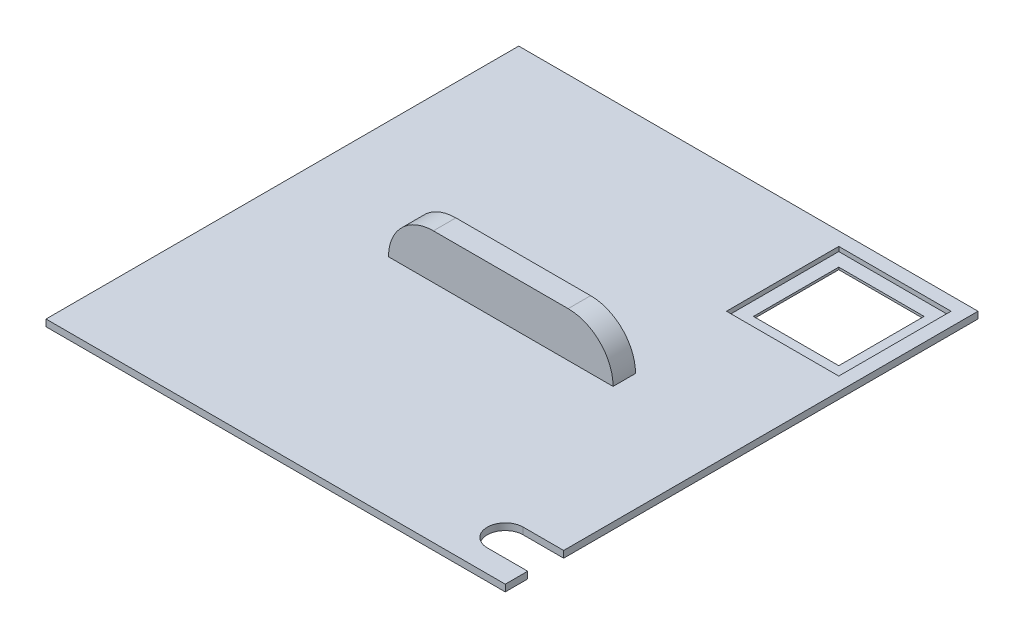
ISO-10303-21;
HEADER;
FILE_DESCRIPTION(('STEP AP214'),'2;1');
FILE_NAME('part.step','',(''),(''),'','','');
FILE_SCHEMA(('AUTOMOTIVE_DESIGN { 1 0 10303 214 1 1 1 1 }'));
ENDSEC;
DATA;
#1=APPLICATION_CONTEXT('core data for automotive mechanical design processes');
#2=APPLICATION_PROTOCOL_DEFINITION('international standard','automotive_design',2000,#1);
#3=PRODUCT_CONTEXT('',#1,'mechanical');
#4=PRODUCT('Part','Part','',(#3));
#5=PRODUCT_RELATED_PRODUCT_CATEGORY('part','',(#4));
#6=PRODUCT_DEFINITION_FORMATION('','',#4);
#7=PRODUCT_DEFINITION_CONTEXT('part definition',#1,'design');
#8=PRODUCT_DEFINITION('design','',#6,#7);
#9=PRODUCT_DEFINITION_SHAPE('','',#8);
#10=(LENGTH_UNIT() NAMED_UNIT(*) SI_UNIT(.MILLI.,.METRE.));
#11=(NAMED_UNIT(*) PLANE_ANGLE_UNIT() SI_UNIT($,.RADIAN.));
#12=(NAMED_UNIT(*) SI_UNIT($,.STERADIAN.) SOLID_ANGLE_UNIT());
#13=UNCERTAINTY_MEASURE_WITH_UNIT(LENGTH_MEASURE(1.E-05),#10,'distance_accuracy_value','');
#14=(GEOMETRIC_REPRESENTATION_CONTEXT(3) GLOBAL_UNCERTAINTY_ASSIGNED_CONTEXT((#13)) GLOBAL_UNIT_ASSIGNED_CONTEXT((#10,
#11,#12)) REPRESENTATION_CONTEXT('',''));
#15=CARTESIAN_POINT('',(0.,0.,0.));
#16=DIRECTION('',(0.,0.,1.));
#17=DIRECTION('',(1.,0.,0.));
#18=AXIS2_PLACEMENT_3D('',#15,#16,#17);
#19=CARTESIAN_POINT('',(0.,0.5,0.));
#20=DIRECTION('',(0.,1.,0.));
#21=DIRECTION('',(0.,0.,1.));
#22=AXIS2_PLACEMENT_3D('',#19,#20,#21);
#23=PLANE('',#22);
#24=DIRECTION('',(0.,0.,-1.));
#25=VECTOR('',#24,1.);
#26=CARTESIAN_POINT('',(23.125,0.5,0.));
#27=LINE('',#26,#25);
#28=CARTESIAN_POINT('',(23.125,0.5,-24.625));
#29=VERTEX_POINT('',#28);
#30=CARTESIAN_POINT('',(23.1249999999999,0.5,-49.6250000000001));
#31=VERTEX_POINT('',#30);
#32=EDGE_CURVE('E207',#29,#31,#27,.T.);
#33=ORIENTED_EDGE('',*,*,#32,.F.);
#34=DIRECTION('',(-1.,0.,0.));
#35=VECTOR('',#34,1.);
#36=CARTESIAN_POINT('',(0.,0.5,-24.625));
#37=LINE('',#36,#35);
#38=CARTESIAN_POINT('',(48.125,0.5,-24.625));
#39=VERTEX_POINT('',#38);
#40=EDGE_CURVE('E209',#39,#29,#37,.T.);
#41=ORIENTED_EDGE('',*,*,#40,.F.);
#42=DIRECTION('',(0.,0.,-1.));
#43=VECTOR('',#42,1.);
#44=CARTESIAN_POINT('',(48.125,0.5,0.));
#45=LINE('',#44,#43);
#46=CARTESIAN_POINT('',(48.125,0.5,-49.625));
#47=VERTEX_POINT('',#46);
#48=EDGE_CURVE('E212',#39,#47,#45,.T.);
#49=ORIENTED_EDGE('',*,*,#48,.T.);
#50=DIRECTION('',(-1.,0.,0.));
#51=VECTOR('',#50,1.);
#52=CARTESIAN_POINT('',(0.,0.5,-49.6250000000001));
#53=LINE('',#52,#51);
#54=EDGE_CURVE('E215',#47,#31,#53,.T.);
#55=ORIENTED_EDGE('',*,*,#54,.T.);
#56=EDGE_LOOP('',(#33,#41,#49,#55));
#57=FACE_BOUND('',#56,.T.);
#58=DIRECTION('',(1.,0.,0.));
#59=VECTOR('',#58,1.);
#60=CARTESIAN_POINT('',(0.,0.5,-46.625));
#61=LINE('',#60,#59);
#62=CARTESIAN_POINT('',(26.125,0.5,-46.625));
#63=VERTEX_POINT('',#62);
#64=CARTESIAN_POINT('',(45.125,0.5,-46.625));
#65=VERTEX_POINT('',#64);
#66=EDGE_CURVE('E182',#63,#65,#61,.T.);
#67=ORIENTED_EDGE('',*,*,#66,.T.);
#68=DIRECTION('',(0.,0.,1.));
#69=VECTOR('',#68,1.);
#70=CARTESIAN_POINT('',(45.125,0.5,0.));
#71=LINE('',#70,#69);
#72=CARTESIAN_POINT('',(45.125,0.5,-27.625));
#73=VERTEX_POINT('',#72);
#74=EDGE_CURVE('E190',#65,#73,#71,.T.);
#75=ORIENTED_EDGE('',*,*,#74,.T.);
#76=DIRECTION('',(1.,0.,0.));
#77=VECTOR('',#76,1.);
#78=CARTESIAN_POINT('',(0.,0.5,-27.625));
#79=LINE('',#78,#77);
#80=CARTESIAN_POINT('',(26.125,0.5,-27.625));
#81=VERTEX_POINT('',#80);
#82=EDGE_CURVE('E187',#81,#73,#79,.T.);
#83=ORIENTED_EDGE('',*,*,#82,.F.);
#84=DIRECTION('',(0.,0.,1.));
#85=VECTOR('',#84,1.);
#86=CARTESIAN_POINT('',(26.125,0.5,0.));
#87=LINE('',#86,#85);
#88=EDGE_CURVE('E58',#63,#81,#87,.T.);
#89=ORIENTED_EDGE('',*,*,#88,.F.);
#90=EDGE_LOOP('',(#67,#75,#83,#89));
#91=FACE_BOUND('',#90,.T.);
#92=ADVANCED_FACE('F43',(#57,#91),#23,.T.);
#93=CARTESIAN_POINT('',(0.,0.,0.));
#94=DIRECTION('',(0.,1.,0.));
#95=DIRECTION('',(0.,0.,1.));
#96=AXIS2_PLACEMENT_3D('',#93,#94,#95);
#97=PLANE('',#96);
#98=CARTESIAN_POINT('',(42.125,0.,43.625));
#99=DIRECTION('',(0.,1.,0.));
#100=DIRECTION('',(0.,0.,1.));
#101=AXIS2_PLACEMENT_3D('',#98,#99,#100);
#102=CIRCLE('',#101,4.);
#103=CARTESIAN_POINT('',(42.125,0.,39.625));
#104=VERTEX_POINT('',#103);
#105=CARTESIAN_POINT('',(42.125,0.,47.625));
#106=VERTEX_POINT('',#105);
#107=EDGE_CURVE('E267',#104,#106,#102,.T.);
#108=ORIENTED_EDGE('',*,*,#107,.T.);
#109=DIRECTION('',(1.,0.,0.));
#110=VECTOR('',#109,1.);
#111=CARTESIAN_POINT('',(0.,0.,47.625));
#112=LINE('',#111,#110);
#113=CARTESIAN_POINT('',(51.125,0.,47.625));
#114=VERTEX_POINT('',#113);
#115=EDGE_CURVE('E274',#106,#114,#112,.T.);
#116=ORIENTED_EDGE('',*,*,#115,.T.);
#117=DIRECTION('',(0.,0.,1.));
#118=VECTOR('',#117,1.);
#119=CARTESIAN_POINT('',(51.125,0.,0.));
#120=LINE('',#119,#118);
#121=CARTESIAN_POINT('',(51.125,0.,52.625));
#122=VERTEX_POINT('',#121);
#123=EDGE_CURVE('E300',#114,#122,#120,.T.);
#124=ORIENTED_EDGE('',*,*,#123,.T.);
#125=DIRECTION('',(1.,0.,0.));
#126=VECTOR('',#125,1.);
#127=CARTESIAN_POINT('',(0.,0.,52.625));
#128=LINE('',#127,#126);
#129=CARTESIAN_POINT('',(-51.125,0.,52.625));
#130=VERTEX_POINT('',#129);
#131=EDGE_CURVE('E305',#130,#122,#128,.T.);
#132=ORIENTED_EDGE('',*,*,#131,.F.);
#133=DIRECTION('',(0.,0.,1.));
#134=VECTOR('',#133,1.);
#135=CARTESIAN_POINT('',(-51.125,0.,0.));
#136=LINE('',#135,#134);
#137=CARTESIAN_POINT('',(-51.125,0.,-52.625));
#138=VERTEX_POINT('',#137);
#139=EDGE_CURVE('E303',#138,#130,#136,.T.);
#140=ORIENTED_EDGE('',*,*,#139,.F.);
#141=DIRECTION('',(1.,0.,0.));
#142=VECTOR('',#141,1.);
#143=CARTESIAN_POINT('',(0.,0.,-52.625));
#144=LINE('',#143,#142);
#145=CARTESIAN_POINT('',(51.125,0.,-52.625));
#146=VERTEX_POINT('',#145);
#147=EDGE_CURVE('E299',#138,#146,#144,.T.);
#148=ORIENTED_EDGE('',*,*,#147,.T.);
#149=CARTESIAN_POINT('',(51.125,0.,39.625));
#150=VERTEX_POINT('',#149);
#151=EDGE_CURVE('E296',#146,#150,#120,.T.);
#152=ORIENTED_EDGE('',*,*,#151,.T.);
#153=DIRECTION('',(1.,0.,0.));
#154=VECTOR('',#153,1.);
#155=CARTESIAN_POINT('',(0.,0.,39.625));
#156=LINE('',#155,#154);
#157=EDGE_CURVE('E293',#104,#150,#156,.T.);
#158=ORIENTED_EDGE('',*,*,#157,.F.);
#159=EDGE_LOOP('',(#108,#116,#124,#132,#140,#148,#152,#158));
#160=FACE_BOUND('',#159,.T.);
#161=DIRECTION('',(0.,0.,1.));
#162=VECTOR('',#161,1.);
#163=CARTESIAN_POINT('',(45.125,0.,0.));
#164=LINE('',#163,#162);
#165=CARTESIAN_POINT('',(45.125,0.,-46.625));
#166=VERTEX_POINT('',#165);
#167=CARTESIAN_POINT('',(45.125,0.,-27.625));
#168=VERTEX_POINT('',#167);
#169=EDGE_CURVE('E11',#166,#168,#164,.T.);
#170=ORIENTED_EDGE('',*,*,#169,.F.);
#171=DIRECTION('',(1.,0.,0.));
#172=VECTOR('',#171,1.);
#173=CARTESIAN_POINT('',(0.,0.,-46.625));
#174=LINE('',#173,#172);
#175=CARTESIAN_POINT('',(26.125,0.,-46.625));
#176=VERTEX_POINT('',#175);
#177=EDGE_CURVE('E184',#176,#166,#174,.T.);
#178=ORIENTED_EDGE('',*,*,#177,.F.);
#179=DIRECTION('',(0.,0.,1.));
#180=VECTOR('',#179,1.);
#181=CARTESIAN_POINT('',(26.125,0.,0.));
#182=LINE('',#181,#180);
#183=CARTESIAN_POINT('',(26.125,0.,-27.625));
#184=VERTEX_POINT('',#183);
#185=EDGE_CURVE('E327',#176,#184,#182,.T.);
#186=ORIENTED_EDGE('',*,*,#185,.T.);
#187=DIRECTION('',(1.,0.,0.));
#188=VECTOR('',#187,1.);
#189=CARTESIAN_POINT('',(0.,0.,-27.625));
#190=LINE('',#189,#188);
#191=EDGE_CURVE('E51',#184,#168,#190,.T.);
#192=ORIENTED_EDGE('',*,*,#191,.T.);
#193=EDGE_LOOP('',(#170,#178,#186,#192));
#194=FACE_BOUND('',#193,.T.);
#195=ADVANCED_FACE('F331',(#160,#194),#97,.F.);
#196=CARTESIAN_POINT('',(0.,1.5,0.));
#197=DIRECTION('',(0.,1.,0.));
#198=DIRECTION('',(0.,0.,1.));
#199=AXIS2_PLACEMENT_3D('',#196,#197,#198);
#200=PLANE('',#199);
#201=DIRECTION('',(0.,0.,-1.));
#202=VECTOR('',#201,1.);
#203=CARTESIAN_POINT('',(25.,1.49999999999993,2.5));
#204=LINE('',#203,#202);
#205=CARTESIAN_POINT('',(25.,1.49999999999993,2.5));
#206=VERTEX_POINT('',#205);
#207=CARTESIAN_POINT('',(25.,1.49999999999993,-2.5));
#208=VERTEX_POINT('',#207);
#209=EDGE_CURVE('E231',#206,#208,#204,.T.);
#210=ORIENTED_EDGE('',*,*,#209,.F.);
#211=DIRECTION('',(1.,0.,0.));
#212=VECTOR('',#211,1.);
#213=CARTESIAN_POINT('',(-15.,1.5,2.5));
#214=LINE('',#213,#212);
#215=CARTESIAN_POINT('',(-25.,1.49999999999993,2.5));
#216=VERTEX_POINT('',#215);
#217=EDGE_CURVE('E253',#216,#206,#214,.T.);
#218=ORIENTED_EDGE('',*,*,#217,.F.);
#219=DIRECTION('',(0.,0.,-1.));
#220=VECTOR('',#219,1.);
#221=CARTESIAN_POINT('',(-25.,1.49999999999993,2.5));
#222=LINE('',#221,#220);
#223=CARTESIAN_POINT('',(-25.,1.49999999999993,-2.5));
#224=VERTEX_POINT('',#223);
#225=EDGE_CURVE('E245',#216,#224,#222,.T.);
#226=ORIENTED_EDGE('',*,*,#225,.T.);
#227=DIRECTION('',(-1.,0.,0.));
#228=VECTOR('',#227,1.);
#229=CARTESIAN_POINT('',(-15.,1.5,-2.5));
#230=LINE('',#229,#228);
#231=EDGE_CURVE('E258',#208,#224,#230,.T.);
#232=ORIENTED_EDGE('',*,*,#231,.F.);
#233=EDGE_LOOP('',(#210,#218,#226,#232));
#234=FACE_BOUND('',#233,.T.);
#235=CARTESIAN_POINT('',(42.125,1.5,43.625));
#236=DIRECTION('',(0.,1.,0.));
#237=DIRECTION('',(0.,0.,1.));
#238=AXIS2_PLACEMENT_3D('',#235,#236,#237);
#239=CIRCLE('',#238,4.);
#240=CARTESIAN_POINT('',(42.125,1.5,39.625));
#241=VERTEX_POINT('',#240);
#242=CARTESIAN_POINT('',(42.125,1.5,47.625));
#243=VERTEX_POINT('',#242);
#244=EDGE_CURVE('E270',#241,#243,#239,.T.);
#245=ORIENTED_EDGE('',*,*,#244,.F.);
#246=DIRECTION('',(1.,0.,0.));
#247=VECTOR('',#246,1.);
#248=CARTESIAN_POINT('',(0.,1.5,39.625));
#249=LINE('',#248,#247);
#250=CARTESIAN_POINT('',(51.125,1.5,39.625));
#251=VERTEX_POINT('',#250);
#252=EDGE_CURVE('E273',#241,#251,#249,.T.);
#253=ORIENTED_EDGE('',*,*,#252,.T.);
#254=DIRECTION('',(0.,0.,1.));
#255=VECTOR('',#254,1.);
#256=CARTESIAN_POINT('',(51.125,1.5,0.));
#257=LINE('',#256,#255);
#258=CARTESIAN_POINT('',(51.125,1.5,-52.625));
#259=VERTEX_POINT('',#258);
#260=EDGE_CURVE('E276',#259,#251,#257,.T.);
#261=ORIENTED_EDGE('',*,*,#260,.F.);
#262=DIRECTION('',(1.,0.,0.));
#263=VECTOR('',#262,1.);
#264=CARTESIAN_POINT('',(0.,1.5,-52.625));
#265=LINE('',#264,#263);
#266=CARTESIAN_POINT('',(-51.125,1.5,-52.625));
#267=VERTEX_POINT('',#266);
#268=EDGE_CURVE('E279',#267,#259,#265,.T.);
#269=ORIENTED_EDGE('',*,*,#268,.F.);
#270=DIRECTION('',(0.,0.,1.));
#271=VECTOR('',#270,1.);
#272=CARTESIAN_POINT('',(-51.125,1.5,0.));
#273=LINE('',#272,#271);
#274=CARTESIAN_POINT('',(-51.125,1.5,52.625));
#275=VERTEX_POINT('',#274);
#276=EDGE_CURVE('E283',#267,#275,#273,.T.);
#277=ORIENTED_EDGE('',*,*,#276,.T.);
#278=DIRECTION('',(1.,0.,0.));
#279=VECTOR('',#278,1.);
#280=CARTESIAN_POINT('',(0.,1.5,52.625));
#281=LINE('',#280,#279);
#282=CARTESIAN_POINT('',(51.125,1.5,52.625));
#283=VERTEX_POINT('',#282);
#284=EDGE_CURVE('E285',#275,#283,#281,.T.);
#285=ORIENTED_EDGE('',*,*,#284,.T.);
#286=CARTESIAN_POINT('',(51.125,1.5,47.625));
#287=VERTEX_POINT('',#286);
#288=EDGE_CURVE('E280',#287,#283,#257,.T.);
#289=ORIENTED_EDGE('',*,*,#288,.F.);
#290=DIRECTION('',(1.,0.,0.));
#291=VECTOR('',#290,1.);
#292=CARTESIAN_POINT('',(0.,1.5,47.625));
#293=LINE('',#292,#291);
#294=EDGE_CURVE('E287',#243,#287,#293,.T.);
#295=ORIENTED_EDGE('',*,*,#294,.F.);
#296=EDGE_LOOP('',(#245,#253,#261,#269,#277,#285,#289,#295));
#297=FACE_BOUND('',#296,.T.);
#298=DIRECTION('',(-1.,0.,0.));
#299=VECTOR('',#298,1.);
#300=CARTESIAN_POINT('',(0.,1.5,-24.625));
#301=LINE('',#300,#299);
#302=CARTESIAN_POINT('',(48.125,1.5,-24.625));
#303=VERTEX_POINT('',#302);
#304=CARTESIAN_POINT('',(23.125,1.5,-24.625));
#305=VERTEX_POINT('',#304);
#306=EDGE_CURVE('E221',#303,#305,#301,.T.);
#307=ORIENTED_EDGE('',*,*,#306,.T.);
#308=DIRECTION('',(0.,0.,-1.));
#309=VECTOR('',#308,1.);
#310=CARTESIAN_POINT('',(23.125,1.5,0.));
#311=LINE('',#310,#309);
#312=CARTESIAN_POINT('',(23.1249999999999,1.5,-49.6250000000001));
#313=VERTEX_POINT('',#312);
#314=EDGE_CURVE('E203',#305,#313,#311,.T.);
#315=ORIENTED_EDGE('',*,*,#314,.T.);
#316=DIRECTION('',(-1.,0.,0.));
#317=VECTOR('',#316,1.);
#318=CARTESIAN_POINT('',(0.,1.5,-49.6250000000001));
#319=LINE('',#318,#317);
#320=CARTESIAN_POINT('',(48.125,1.5,-49.625));
#321=VERTEX_POINT('',#320);
#322=EDGE_CURVE('E210',#321,#313,#319,.T.);
#323=ORIENTED_EDGE('',*,*,#322,.F.);
#324=DIRECTION('',(0.,0.,-1.));
#325=VECTOR('',#324,1.);
#326=CARTESIAN_POINT('',(48.125,1.5,0.));
#327=LINE('',#326,#325);
#328=EDGE_CURVE('E224',#303,#321,#327,.T.);
#329=ORIENTED_EDGE('',*,*,#328,.F.);
#330=EDGE_LOOP('',(#307,#315,#323,#329));
#331=FACE_BOUND('',#330,.T.);
#332=ADVANCED_FACE('F350',(#234,#297,#331),#200,.T.);
#333=CARTESIAN_POINT('',(42.125,1.5,43.625));
#334=DIRECTION('',(0.,-1.,0.));
#335=DIRECTION('',(0.,0.,-1.));
#336=AXIS2_PLACEMENT_3D('',#333,#334,#335);
#337=CYLINDRICAL_SURFACE('',#336,4.);
#338=ORIENTED_EDGE('',*,*,#107,.F.);
#339=DIRECTION('',(0.,-1.,0.));
#340=VECTOR('',#339,1.);
#341=CARTESIAN_POINT('',(42.125,1.5,39.625));
#342=LINE('',#341,#340);
#343=EDGE_CURVE('E324',#241,#104,#342,.T.);
#344=ORIENTED_EDGE('',*,*,#343,.F.);
#345=ORIENTED_EDGE('',*,*,#244,.T.);
#346=DIRECTION('',(0.,-1.,0.));
#347=VECTOR('',#346,1.);
#348=CARTESIAN_POINT('',(42.125,1.5,47.625));
#349=LINE('',#348,#347);
#350=EDGE_CURVE('E290',#243,#106,#349,.T.);
#351=ORIENTED_EDGE('',*,*,#350,.T.);
#352=EDGE_LOOP('',(#338,#344,#345,#351));
#353=FACE_BOUND('',#352,.T.);
#354=ADVANCED_FACE('F45',(#353),#337,.F.);
#355=CARTESIAN_POINT('',(0.,1.5,39.625));
#356=DIRECTION('',(0.,0.,-1.));
#357=DIRECTION('',(-1.,0.,0.));
#358=AXIS2_PLACEMENT_3D('',#355,#356,#357);
#359=PLANE('',#358);
#360=ORIENTED_EDGE('',*,*,#157,.T.);
#361=DIRECTION('',(0.,-1.,0.));
#362=VECTOR('',#361,1.);
#363=CARTESIAN_POINT('',(51.125,1.5,39.625));
#364=LINE('',#363,#362);
#365=EDGE_CURVE('E322',#251,#150,#364,.T.);
#366=ORIENTED_EDGE('',*,*,#365,.F.);
#367=ORIENTED_EDGE('',*,*,#252,.F.);
#368=ORIENTED_EDGE('',*,*,#343,.T.);
#369=EDGE_LOOP('',(#360,#366,#367,#368));
#370=FACE_BOUND('',#369,.T.);
#371=ADVANCED_FACE('F414',(#370),#359,.F.);
#372=CARTESIAN_POINT('',(51.125,1.5,0.));
#373=DIRECTION('',(1.,0.,0.));
#374=DIRECTION('',(0.,0.,-1.));
#375=AXIS2_PLACEMENT_3D('',#372,#373,#374);
#376=PLANE('',#375);
#377=ORIENTED_EDGE('',*,*,#151,.F.);
#378=DIRECTION('',(0.,-1.,0.));
#379=VECTOR('',#378,1.);
#380=CARTESIAN_POINT('',(51.125,1.5,-52.625));
#381=LINE('',#380,#379);
#382=EDGE_CURVE('E320',#259,#146,#381,.T.);
#383=ORIENTED_EDGE('',*,*,#382,.F.);
#384=ORIENTED_EDGE('',*,*,#260,.T.);
#385=ORIENTED_EDGE('',*,*,#365,.T.);
#386=EDGE_LOOP('',(#377,#383,#384,#385));
#387=FACE_BOUND('',#386,.T.);
#388=ADVANCED_FACE('F403',(#387),#376,.T.);
#389=CARTESIAN_POINT('',(0.,1.5,-52.625));
#390=DIRECTION('',(0.,0.,-1.));
#391=DIRECTION('',(-1.,0.,0.));
#392=AXIS2_PLACEMENT_3D('',#389,#390,#391);
#393=PLANE('',#392);
#394=ORIENTED_EDGE('',*,*,#147,.F.);
#395=DIRECTION('',(0.,-1.,0.));
#396=VECTOR('',#395,1.);
#397=CARTESIAN_POINT('',(-51.125,1.5,-52.625));
#398=LINE('',#397,#396);
#399=EDGE_CURVE('E318',#267,#138,#398,.T.);
#400=ORIENTED_EDGE('',*,*,#399,.F.);
#401=ORIENTED_EDGE('',*,*,#268,.T.);
#402=ORIENTED_EDGE('',*,*,#382,.T.);
#403=EDGE_LOOP('',(#394,#400,#401,#402));
#404=FACE_BOUND('',#403,.T.);
#405=ADVANCED_FACE('F410',(#404),#393,.T.);
#406=CARTESIAN_POINT('',(-51.125,1.5,0.));
#407=DIRECTION('',(1.,0.,0.));
#408=DIRECTION('',(0.,0.,-1.));
#409=AXIS2_PLACEMENT_3D('',#406,#407,#408);
#410=PLANE('',#409);
#411=ORIENTED_EDGE('',*,*,#139,.T.);
#412=DIRECTION('',(0.,-1.,0.));
#413=VECTOR('',#412,1.);
#414=CARTESIAN_POINT('',(-51.125,1.5,52.625));
#415=LINE('',#414,#413);
#416=EDGE_CURVE('E315',#275,#130,#415,.T.);
#417=ORIENTED_EDGE('',*,*,#416,.F.);
#418=ORIENTED_EDGE('',*,*,#276,.F.);
#419=ORIENTED_EDGE('',*,*,#399,.T.);
#420=EDGE_LOOP('',(#411,#417,#418,#419));
#421=FACE_BOUND('',#420,.T.);
#422=ADVANCED_FACE('F406',(#421),#410,.F.);
#423=CARTESIAN_POINT('',(0.,1.5,52.625));
#424=DIRECTION('',(0.,0.,-1.));
#425=DIRECTION('',(-1.,0.,0.));
#426=AXIS2_PLACEMENT_3D('',#423,#424,#425);
#427=PLANE('',#426);
#428=ORIENTED_EDGE('',*,*,#131,.T.);
#429=DIRECTION('',(0.,-1.,0.));
#430=VECTOR('',#429,1.);
#431=CARTESIAN_POINT('',(51.125,1.5,52.625));
#432=LINE('',#431,#430);
#433=EDGE_CURVE('E313',#283,#122,#432,.T.);
#434=ORIENTED_EDGE('',*,*,#433,.F.);
#435=ORIENTED_EDGE('',*,*,#284,.F.);
#436=ORIENTED_EDGE('',*,*,#416,.T.);
#437=EDGE_LOOP('',(#428,#434,#435,#436));
#438=FACE_BOUND('',#437,.T.);
#439=ADVANCED_FACE('F401',(#438),#427,.F.);
#440=ORIENTED_EDGE('',*,*,#123,.F.);
#441=DIRECTION('',(0.,-1.,0.));
#442=VECTOR('',#441,1.);
#443=CARTESIAN_POINT('',(51.125,1.5,47.625));
#444=LINE('',#443,#442);
#445=EDGE_CURVE('E311',#287,#114,#444,.T.);
#446=ORIENTED_EDGE('',*,*,#445,.F.);
#447=ORIENTED_EDGE('',*,*,#288,.T.);
#448=ORIENTED_EDGE('',*,*,#433,.T.);
#449=EDGE_LOOP('',(#440,#446,#447,#448));
#450=FACE_BOUND('',#449,.T.);
#451=ADVANCED_FACE('F397',(#450),#376,.T.);
#452=CARTESIAN_POINT('',(0.,1.5,47.625));
#453=DIRECTION('',(0.,0.,-1.));
#454=DIRECTION('',(-1.,0.,0.));
#455=AXIS2_PLACEMENT_3D('',#452,#453,#454);
#456=PLANE('',#455);
#457=ORIENTED_EDGE('',*,*,#115,.F.);
#458=ORIENTED_EDGE('',*,*,#350,.F.);
#459=ORIENTED_EDGE('',*,*,#294,.T.);
#460=ORIENTED_EDGE('',*,*,#445,.T.);
#461=EDGE_LOOP('',(#457,#458,#459,#460));
#462=FACE_BOUND('',#461,.T.);
#463=ADVANCED_FACE('F390',(#462),#456,.T.);
#464=CARTESIAN_POINT('',(-15.,11.5,2.5));
#465=DIRECTION('',(0.,0.,-1.));
#466=DIRECTION('',(-1.,0.,0.));
#467=AXIS2_PLACEMENT_3D('',#464,#465,#466);
#468=PLANE('',#467);
#469=ORIENTED_EDGE('',*,*,#217,.T.);
#470=CARTESIAN_POINT('',(15.,1.5,2.5));
#471=DIRECTION('',(0.,0.,1.));
#472=DIRECTION('',(1.,0.,0.));
#473=AXIS2_PLACEMENT_3D('',#470,#471,#472);
#474=CIRCLE('',#473,10.);
#475=CARTESIAN_POINT('',(15.,11.5,2.5));
#476=VERTEX_POINT('',#475);
#477=EDGE_CURVE('E242',#206,#476,#474,.T.);
#478=ORIENTED_EDGE('',*,*,#477,.T.);
#479=DIRECTION('',(1.,0.,0.));
#480=VECTOR('',#479,1.);
#481=CARTESIAN_POINT('',(-15.,11.5,2.5));
#482=LINE('',#481,#480);
#483=CARTESIAN_POINT('',(-15.,11.5,2.5));
#484=VERTEX_POINT('',#483);
#485=EDGE_CURVE('E257',#484,#476,#482,.T.);
#486=ORIENTED_EDGE('',*,*,#485,.F.);
#487=CARTESIAN_POINT('',(-15.,1.5,2.5));
#488=DIRECTION('',(0.,0.,-1.));
#489=DIRECTION('',(-1.,0.,0.));
#490=AXIS2_PLACEMENT_3D('',#487,#488,#489);
#491=CIRCLE('',#490,10.);
#492=EDGE_CURVE('E251',#216,#484,#491,.T.);
#493=ORIENTED_EDGE('',*,*,#492,.F.);
#494=EDGE_LOOP('',(#469,#478,#486,#493));
#495=FACE_BOUND('',#494,.T.);
#496=ADVANCED_FACE('F386',(#495),#468,.F.);
#497=CARTESIAN_POINT('',(-15.,11.5,-2.5));
#498=DIRECTION('',(0.,0.,1.));
#499=DIRECTION('',(1.,0.,0.));
#500=AXIS2_PLACEMENT_3D('',#497,#498,#499);
#501=PLANE('',#500);
#502=ORIENTED_EDGE('',*,*,#231,.T.);
#503=CARTESIAN_POINT('',(-15.,1.5,-2.5));
#504=DIRECTION('',(0.,0.,-1.));
#505=DIRECTION('',(-1.,0.,0.));
#506=AXIS2_PLACEMENT_3D('',#503,#504,#505);
#507=CIRCLE('',#506,10.);
#508=CARTESIAN_POINT('',(-15.,11.5,-2.5));
#509=VERTEX_POINT('',#508);
#510=EDGE_CURVE('E248',#224,#509,#507,.T.);
#511=ORIENTED_EDGE('',*,*,#510,.T.);
#512=DIRECTION('',(-1.,0.,0.));
#513=VECTOR('',#512,1.);
#514=CARTESIAN_POINT('',(-15.,11.5,-2.5));
#515=LINE('',#514,#513);
#516=CARTESIAN_POINT('',(15.,11.5,-2.5));
#517=VERTEX_POINT('',#516);
#518=EDGE_CURVE('E264',#517,#509,#515,.T.);
#519=ORIENTED_EDGE('',*,*,#518,.F.);
#520=CARTESIAN_POINT('',(15.,1.5,-2.5));
#521=DIRECTION('',(0.,0.,1.));
#522=DIRECTION('',(1.,0.,0.));
#523=AXIS2_PLACEMENT_3D('',#520,#521,#522);
#524=CIRCLE('',#523,10.);
#525=EDGE_CURVE('E240',#208,#517,#524,.T.);
#526=ORIENTED_EDGE('',*,*,#525,.F.);
#527=EDGE_LOOP('',(#502,#511,#519,#526));
#528=FACE_BOUND('',#527,.T.);
#529=ADVANCED_FACE('F382',(#528),#501,.F.);
#530=CARTESIAN_POINT('',(0.,11.5,0.));
#531=DIRECTION('',(0.,1.,0.));
#532=DIRECTION('',(0.,0.,1.));
#533=AXIS2_PLACEMENT_3D('',#530,#531,#532);
#534=PLANE('',#533);
#535=DIRECTION('',(0.,0.,1.));
#536=VECTOR('',#535,1.);
#537=CARTESIAN_POINT('',(-15.,11.5,-2.5));
#538=LINE('',#537,#536);
#539=EDGE_CURVE('E254',#509,#484,#538,.T.);
#540=ORIENTED_EDGE('',*,*,#539,.T.);
#541=ORIENTED_EDGE('',*,*,#485,.T.);
#542=DIRECTION('',(0.,0.,-1.));
#543=VECTOR('',#542,1.);
#544=CARTESIAN_POINT('',(15.,11.5,-2.5));
#545=LINE('',#544,#543);
#546=EDGE_CURVE('E261',#476,#517,#545,.T.);
#547=ORIENTED_EDGE('',*,*,#546,.T.);
#548=ORIENTED_EDGE('',*,*,#518,.T.);
#549=EDGE_LOOP('',(#540,#541,#547,#548));
#550=FACE_BOUND('',#549,.T.);
#551=ADVANCED_FACE('F378',(#550),#534,.T.);
#552=CARTESIAN_POINT('',(-15.,1.5,2.5));
#553=DIRECTION('',(0.,0.,-1.));
#554=DIRECTION('',(-1.,0.,0.));
#555=AXIS2_PLACEMENT_3D('',#552,#553,#554);
#556=CYLINDRICAL_SURFACE('',#555,10.);
#557=ORIENTED_EDGE('',*,*,#539,.F.);
#558=ORIENTED_EDGE('',*,*,#510,.F.);
#559=ORIENTED_EDGE('',*,*,#225,.F.);
#560=ORIENTED_EDGE('',*,*,#492,.T.);
#561=EDGE_LOOP('',(#557,#558,#559,#560));
#562=FACE_BOUND('',#561,.T.);
#563=ADVANCED_FACE('F374',(#562),#556,.T.);
#564=CARTESIAN_POINT('',(15.,1.5,2.5));
#565=DIRECTION('',(0.,0.,-1.));
#566=DIRECTION('',(1.,0.,0.));
#567=AXIS2_PLACEMENT_3D('',#564,#565,#566);
#568=CYLINDRICAL_SURFACE('',#567,10.);
#569=ORIENTED_EDGE('',*,*,#525,.T.);
#570=ORIENTED_EDGE('',*,*,#546,.F.);
#571=ORIENTED_EDGE('',*,*,#477,.F.);
#572=ORIENTED_EDGE('',*,*,#209,.T.);
#573=EDGE_LOOP('',(#569,#570,#571,#572));
#574=FACE_BOUND('',#573,.T.);
#575=ADVANCED_FACE('F370',(#574),#568,.T.);
#576=CARTESIAN_POINT('',(23.125,0.5,0.));
#577=DIRECTION('',(1.,0.,0.));
#578=DIRECTION('',(0.,0.,-1.));
#579=AXIS2_PLACEMENT_3D('',#576,#577,#578);
#580=PLANE('',#579);
#581=ORIENTED_EDGE('',*,*,#314,.F.);
#582=DIRECTION('',(0.,1.,0.));
#583=VECTOR('',#582,1.);
#584=CARTESIAN_POINT('',(23.125,0.5,-24.625));
#585=LINE('',#584,#583);
#586=EDGE_CURVE('E218',#29,#305,#585,.T.);
#587=ORIENTED_EDGE('',*,*,#586,.F.);
#588=ORIENTED_EDGE('',*,*,#32,.T.);
#589=DIRECTION('',(0.,1.,0.));
#590=VECTOR('',#589,1.);
#591=CARTESIAN_POINT('',(23.1249999999999,0.5,-49.6250000000001));
#592=LINE('',#591,#590);
#593=EDGE_CURVE('E229',#31,#313,#592,.T.);
#594=ORIENTED_EDGE('',*,*,#593,.T.);
#595=EDGE_LOOP('',(#581,#587,#588,#594));
#596=FACE_BOUND('',#595,.T.);
#597=ADVANCED_FACE('F360',(#596),#580,.T.);
#598=CARTESIAN_POINT('',(0.,0.5,-49.6250000000001));
#599=DIRECTION('',(0.,0.,-1.));
#600=DIRECTION('',(-1.,0.,0.));
#601=AXIS2_PLACEMENT_3D('',#598,#599,#600);
#602=PLANE('',#601);
#603=ORIENTED_EDGE('',*,*,#322,.T.);
#604=ORIENTED_EDGE('',*,*,#593,.F.);
#605=ORIENTED_EDGE('',*,*,#54,.F.);
#606=DIRECTION('',(0.,1.,0.));
#607=VECTOR('',#606,1.);
#608=CARTESIAN_POINT('',(48.125,0.5,-49.625));
#609=LINE('',#608,#607);
#610=EDGE_CURVE('E232',#47,#321,#609,.T.);
#611=ORIENTED_EDGE('',*,*,#610,.T.);
#612=EDGE_LOOP('',(#603,#604,#605,#611));
#613=FACE_BOUND('',#612,.T.);
#614=ADVANCED_FACE('F356',(#613),#602,.F.);
#615=CARTESIAN_POINT('',(48.125,0.5,0.));
#616=DIRECTION('',(1.,0.,0.));
#617=DIRECTION('',(0.,0.,-1.));
#618=AXIS2_PLACEMENT_3D('',#615,#616,#617);
#619=PLANE('',#618);
#620=ORIENTED_EDGE('',*,*,#328,.T.);
#621=ORIENTED_EDGE('',*,*,#610,.F.);
#622=ORIENTED_EDGE('',*,*,#48,.F.);
#623=DIRECTION('',(0.,1.,0.));
#624=VECTOR('',#623,1.);
#625=CARTESIAN_POINT('',(48.125,0.5,-24.625));
#626=LINE('',#625,#624);
#627=EDGE_CURVE('E234',#39,#303,#626,.T.);
#628=ORIENTED_EDGE('',*,*,#627,.T.);
#629=EDGE_LOOP('',(#620,#621,#622,#628));
#630=FACE_BOUND('',#629,.T.);
#631=ADVANCED_FACE('F359',(#630),#619,.F.);
#632=CARTESIAN_POINT('',(0.,0.5,-24.625));
#633=DIRECTION('',(0.,0.,-1.));
#634=DIRECTION('',(-1.,0.,0.));
#635=AXIS2_PLACEMENT_3D('',#632,#633,#634);
#636=PLANE('',#635);
#637=ORIENTED_EDGE('',*,*,#306,.F.);
#638=ORIENTED_EDGE('',*,*,#627,.F.);
#639=ORIENTED_EDGE('',*,*,#40,.T.);
#640=ORIENTED_EDGE('',*,*,#586,.T.);
#641=EDGE_LOOP('',(#637,#638,#639,#640));
#642=FACE_BOUND('',#641,.T.);
#643=ADVANCED_FACE('F364',(#642),#636,.T.);
#644=CARTESIAN_POINT('',(45.125,-2.5,0.));
#645=DIRECTION('',(-1.,0.,0.));
#646=DIRECTION('',(0.,0.,1.));
#647=AXIS2_PLACEMENT_3D('',#644,#645,#646);
#648=PLANE('',#647);
#649=ORIENTED_EDGE('',*,*,#169,.T.);
#650=DIRECTION('',(0.,1.,0.));
#651=VECTOR('',#650,1.);
#652=CARTESIAN_POINT('',(45.125,-2.5,-27.625));
#653=LINE('',#652,#651);
#654=EDGE_CURVE('E193',#168,#73,#653,.T.);
#655=ORIENTED_EDGE('',*,*,#654,.T.);
#656=ORIENTED_EDGE('',*,*,#74,.F.);
#657=DIRECTION('',(0.,1.,0.));
#658=VECTOR('',#657,1.);
#659=CARTESIAN_POINT('',(45.125,-2.5,-46.625));
#660=LINE('',#659,#658);
#661=EDGE_CURVE('E178',#166,#65,#660,.T.);
#662=ORIENTED_EDGE('',*,*,#661,.F.);
#663=EDGE_LOOP('',(#649,#655,#656,#662));
#664=FACE_BOUND('',#663,.T.);
#665=ADVANCED_FACE('F191',(#664),#648,.T.);
#666=CARTESIAN_POINT('',(0.,-2.5,-27.625));
#667=DIRECTION('',(0.,0.,1.));
#668=DIRECTION('',(1.,0.,0.));
#669=AXIS2_PLACEMENT_3D('',#666,#667,#668);
#670=PLANE('',#669);
#671=DIRECTION('',(0.,1.,0.));
#672=VECTOR('',#671,1.);
#673=CARTESIAN_POINT('',(26.125,-2.5,-27.625));
#674=LINE('',#673,#672);
#675=EDGE_CURVE('E204',#184,#81,#674,.T.);
#676=ORIENTED_EDGE('',*,*,#675,.T.);
#677=ORIENTED_EDGE('',*,*,#82,.T.);
#678=ORIENTED_EDGE('',*,*,#654,.F.);
#679=ORIENTED_EDGE('',*,*,#191,.F.);
#680=EDGE_LOOP('',(#676,#677,#678,#679));
#681=FACE_BOUND('',#680,.T.);
#682=ADVANCED_FACE('F333',(#681),#670,.F.);
#683=CARTESIAN_POINT('',(26.125,-2.5,0.));
#684=DIRECTION('',(-1.,0.,0.));
#685=DIRECTION('',(0.,0.,1.));
#686=AXIS2_PLACEMENT_3D('',#683,#684,#685);
#687=PLANE('',#686);
#688=DIRECTION('',(0.,1.,0.));
#689=VECTOR('',#688,1.);
#690=CARTESIAN_POINT('',(26.125,-2.5,-46.625));
#691=LINE('',#690,#689);
#692=EDGE_CURVE('E65',#176,#63,#691,.T.);
#693=ORIENTED_EDGE('',*,*,#692,.T.);
#694=ORIENTED_EDGE('',*,*,#88,.T.);
#695=ORIENTED_EDGE('',*,*,#675,.F.);
#696=ORIENTED_EDGE('',*,*,#185,.F.);
#697=EDGE_LOOP('',(#693,#694,#695,#696));
#698=FACE_BOUND('',#697,.T.);
#699=ADVANCED_FACE('F334',(#698),#687,.F.);
#700=CARTESIAN_POINT('',(0.,-2.5,-46.625));
#701=DIRECTION('',(0.,0.,1.));
#702=DIRECTION('',(1.,0.,0.));
#703=AXIS2_PLACEMENT_3D('',#700,#701,#702);
#704=PLANE('',#703);
#705=ORIENTED_EDGE('',*,*,#177,.T.);
#706=ORIENTED_EDGE('',*,*,#661,.T.);
#707=ORIENTED_EDGE('',*,*,#66,.F.);
#708=ORIENTED_EDGE('',*,*,#692,.F.);
#709=EDGE_LOOP('',(#705,#706,#707,#708));
#710=FACE_BOUND('',#709,.T.);
#711=ADVANCED_FACE('F180',(#710),#704,.T.);
#712=CLOSED_SHELL('',(#92,#195,#332,#354,#371,#388,#405,#422,#439,#451,#463,#496,#529,#551,#563,
#575,#597,#614,#631,#643,#665,#682,#699,#711));
#713=MANIFOLD_SOLID_BREP('B2',#712);
#714=ADVANCED_BREP_SHAPE_REPRESENTATION('',(#18,#713),#14);
#715=SHAPE_DEFINITION_REPRESENTATION(#9,#714);
ENDSEC;
END-ISO-10303-21;
